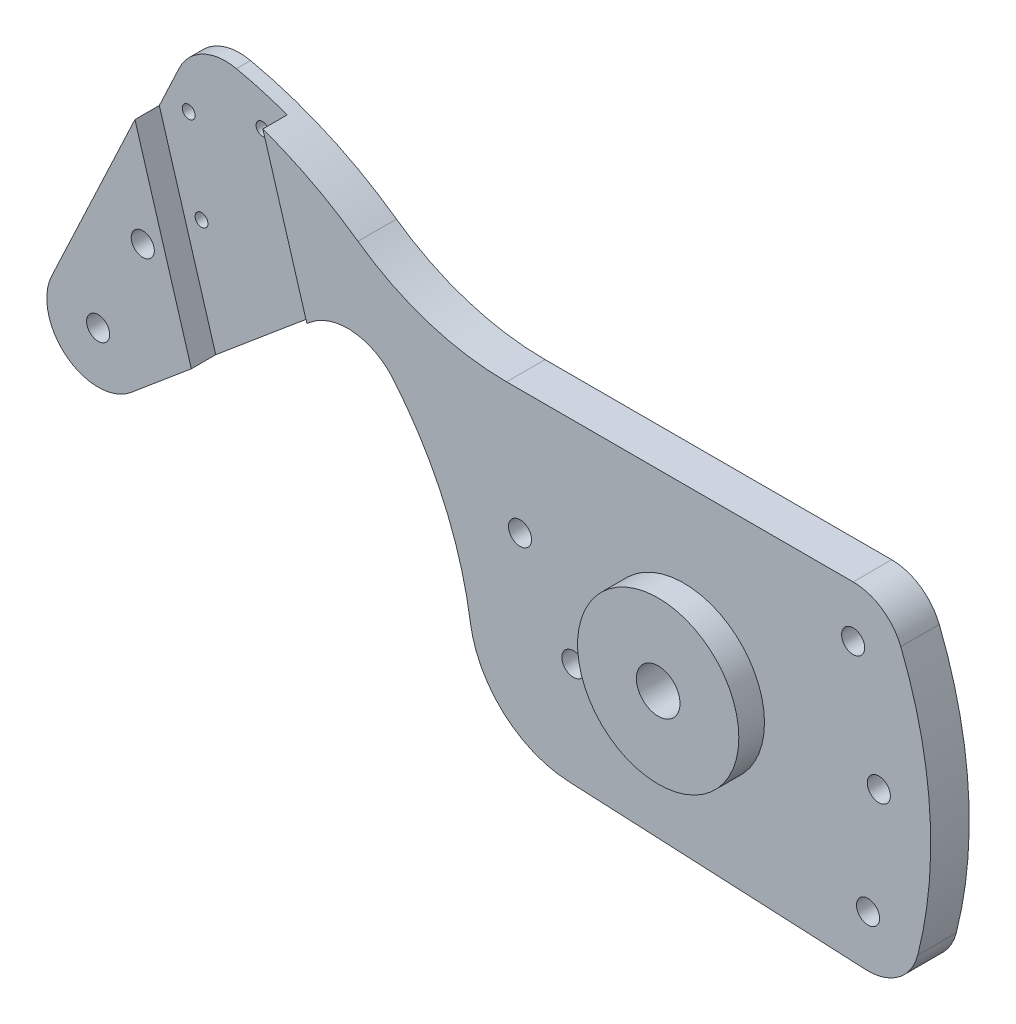
ISO-10303-21;
HEADER;
FILE_DESCRIPTION(('STEP AP214'),'2;1');
FILE_NAME('part.step','',(''),(''),'','','');
FILE_SCHEMA(('AUTOMOTIVE_DESIGN { 1 0 10303 214 1 1 1 1 }'));
ENDSEC;
DATA;
#1=APPLICATION_CONTEXT('core data for automotive mechanical design processes');
#2=APPLICATION_PROTOCOL_DEFINITION('international standard','automotive_design',2000,#1);
#3=PRODUCT_CONTEXT('',#1,'mechanical');
#4=PRODUCT('Part','Part','',(#3));
#5=PRODUCT_RELATED_PRODUCT_CATEGORY('part','',(#4));
#6=PRODUCT_DEFINITION_FORMATION('','',#4);
#7=PRODUCT_DEFINITION_CONTEXT('part definition',#1,'design');
#8=PRODUCT_DEFINITION('design','',#6,#7);
#9=PRODUCT_DEFINITION_SHAPE('','',#8);
#10=(LENGTH_UNIT() NAMED_UNIT(*) SI_UNIT(.MILLI.,.METRE.));
#11=(NAMED_UNIT(*) PLANE_ANGLE_UNIT() SI_UNIT($,.RADIAN.));
#12=(NAMED_UNIT(*) SI_UNIT($,.STERADIAN.) SOLID_ANGLE_UNIT());
#13=UNCERTAINTY_MEASURE_WITH_UNIT(LENGTH_MEASURE(1.E-05),#10,'distance_accuracy_value','');
#14=(GEOMETRIC_REPRESENTATION_CONTEXT(3) GLOBAL_UNCERTAINTY_ASSIGNED_CONTEXT((#13)) GLOBAL_UNIT_ASSIGNED_CONTEXT((#10,
#11,#12)) REPRESENTATION_CONTEXT('',''));
#15=CARTESIAN_POINT('',(0.,0.,0.));
#16=DIRECTION('',(0.,0.,1.));
#17=DIRECTION('',(1.,0.,0.));
#18=AXIS2_PLACEMENT_3D('',#15,#16,#17);
#19=CARTESIAN_POINT('',(-74.1892847970259,-68.5571228840362,-2.));
#20=DIRECTION('',(-0.95769511445002,-0.287784759427187,0.));
#21=DIRECTION('',(0.287784759427187,-0.95769511445002,0.));
#22=AXIS2_PLACEMENT_3D('',#19,#20,#21);
#23=PLANE('',#22);
#24=DIRECTION('',(-0.287784759427187,0.957695114450019,0.));
#25=VECTOR('',#24,1.);
#26=CARTESIAN_POINT('',(-95.9576660688243,3.88407391520334,2.75));
#27=LINE('',#26,#25);
#28=CARTESIAN_POINT('',(-95.9576660688243,3.88407391520334,2.75));
#29=VERTEX_POINT('',#28);
#30=CARTESIAN_POINT('',(-106.945535827358,40.4496974975837,2.75));
#31=VERTEX_POINT('',#30);
#32=EDGE_CURVE('E169',#29,#31,#27,.T.);
#33=ORIENTED_EDGE('',*,*,#32,.F.);
#34=DIRECTION('',(0.,0.,1.));
#35=VECTOR('',#34,1.);
#36=CARTESIAN_POINT('',(-95.9576660688243,3.88407391520334,4.75));
#37=LINE('',#36,#35);
#38=CARTESIAN_POINT('',(-95.9576660688243,3.88407391520334,-2.));
#39=VERTEX_POINT('',#38);
#40=EDGE_CURVE('E180',#39,#29,#37,.T.);
#41=ORIENTED_EDGE('',*,*,#40,.F.);
#42=DIRECTION('',(-0.287784759427187,0.95769511445002,0.));
#43=VECTOR('',#42,1.);
#44=CARTESIAN_POINT('',(-74.1892847970259,-68.5571228840362,-2.));
#45=LINE('',#44,#43);
#46=CARTESIAN_POINT('',(-106.945535827358,40.4496974975837,-2.));
#47=VERTEX_POINT('',#46);
#48=EDGE_CURVE('E11',#39,#47,#45,.T.);
#49=ORIENTED_EDGE('',*,*,#48,.T.);
#50=DIRECTION('',(0.,0.,1.));
#51=VECTOR('',#50,1.);
#52=CARTESIAN_POINT('',(-106.945535827358,40.4496974975837,4.75));
#53=LINE('',#52,#51);
#54=EDGE_CURVE('E183',#47,#31,#53,.T.);
#55=ORIENTED_EDGE('',*,*,#54,.T.);
#56=EDGE_LOOP('',(#33,#41,#49,#55));
#57=FACE_BOUND('',#56,.T.);
#58=ADVANCED_FACE('F40',(#57),#23,.F.);
#59=CARTESIAN_POINT('',(-48.3315167068753,-60.7869343795021,-2.));
#60=DIRECTION('',(0.95769511445002,0.287784759427187,0.));
#61=DIRECTION('',(-0.287784759427187,0.95769511445002,0.));
#62=AXIS2_PLACEMENT_3D('',#59,#60,#61);
#63=PLANE('',#62);
#64=DIRECTION('',(0.287784759427188,-0.95769511445002,0.));
#65=VECTOR('',#64,1.);
#66=CARTESIAN_POINT('',(-82.0220970357489,51.329163249051,2.75));
#67=LINE('',#66,#65);
#68=CARTESIAN_POINT('',(-82.0220970357489,51.329163249051,2.75));
#69=VERTEX_POINT('',#68);
#70=CARTESIAN_POINT('',(-73.4421904308482,22.7768012188099,2.75));
#71=VERTEX_POINT('',#70);
#72=EDGE_CURVE('E429',#69,#71,#67,.T.);
#73=ORIENTED_EDGE('',*,*,#72,.F.);
#74=DIRECTION('',(0.,0.,-1.));
#75=VECTOR('',#74,1.);
#76=CARTESIAN_POINT('',(-82.0220970357489,51.3291632490509,4.75));
#77=LINE('',#76,#75);
#78=CARTESIAN_POINT('',(-82.0220970357489,51.3291632490509,-2.));
#79=VERTEX_POINT('',#78);
#80=EDGE_CURVE('E191',#79,#69,#77,.F.);
#81=ORIENTED_EDGE('',*,*,#80,.F.);
#82=DIRECTION('',(-0.287784759427187,0.95769511445002,0.));
#83=VECTOR('',#82,1.);
#84=CARTESIAN_POINT('',(-48.3315167068753,-60.7869343795021,-2.));
#85=LINE('',#84,#83);
#86=CARTESIAN_POINT('',(-73.4421904308482,22.7768012188099,-2.));
#87=VERTEX_POINT('',#86);
#88=EDGE_CURVE('E50',#87,#79,#85,.T.);
#89=ORIENTED_EDGE('',*,*,#88,.F.);
#90=DIRECTION('',(0.,0.,-1.));
#91=VECTOR('',#90,1.);
#92=CARTESIAN_POINT('',(-73.4421904308482,22.7768012188099,4.75));
#93=LINE('',#92,#91);
#94=EDGE_CURVE('E190',#71,#87,#93,.T.);
#95=ORIENTED_EDGE('',*,*,#94,.F.);
#96=EDGE_LOOP('',(#73,#81,#89,#95));
#97=FACE_BOUND('',#96,.T.);
#98=ADVANCED_FACE('F42',(#97),#63,.F.);
#99=CARTESIAN_POINT('',(-41.5599291638824,49.5291948890183,4.75));
#100=DIRECTION('',(-0.642787609686535,0.766044443118982,0.));
#101=DIRECTION('',(-0.766044443118982,-0.642787609686535,0.));
#102=AXIS2_PLACEMENT_3D('',#99,#100,#101);
#103=PLANE('',#102);
#104=DIRECTION('',(0.766044443118982,0.642787609686534,0.));
#105=VECTOR('',#104,1.);
#106=CARTESIAN_POINT('',(-107.689906175498,-5.96044443118984,2.75));
#107=LINE('',#106,#105);
#108=CARTESIAN_POINT('',(-107.689906175498,-5.96044443118984,2.75));
#109=VERTEX_POINT('',#108);
#110=EDGE_CURVE('E166',#109,#29,#107,.T.);
#111=ORIENTED_EDGE('',*,*,#110,.F.);
#112=DIRECTION('',(0.,0.,-1.));
#113=VECTOR('',#112,1.);
#114=CARTESIAN_POINT('',(-107.689906175498,-5.96044443118984,4.75));
#115=LINE('',#114,#113);
#116=CARTESIAN_POINT('',(-107.689906175498,-5.96044443118984,-4.75));
#117=VERTEX_POINT('',#116);
#118=EDGE_CURVE('E238',#109,#117,#115,.T.);
#119=ORIENTED_EDGE('',*,*,#118,.T.);
#120=DIRECTION('',(0.766044443118982,0.642787609686535,0.));
#121=VECTOR('',#120,1.);
#122=CARTESIAN_POINT('',(-41.5599291638824,49.5291948890183,-4.75));
#123=LINE('',#122,#121);
#124=CARTESIAN_POINT('',(-72.8648183450266,23.2612739230748,-4.75));
#125=VERTEX_POINT('',#124);
#126=EDGE_CURVE('E332',#117,#125,#123,.T.);
#127=ORIENTED_EDGE('',*,*,#126,.T.);
#128=DIRECTION('',(0.,0.,-1.));
#129=VECTOR('',#128,1.);
#130=CARTESIAN_POINT('',(-72.8648183450266,23.2612739230748,4.75));
#131=LINE('',#130,#129);
#132=CARTESIAN_POINT('',(-72.8648183450266,23.2612739230748,2.75));
#133=VERTEX_POINT('',#132);
#134=EDGE_CURVE('E241',#133,#125,#131,.T.);
#135=ORIENTED_EDGE('',*,*,#134,.F.);
#136=DIRECTION('',(0.766044443118984,0.642787609686532,0.));
#137=VECTOR('',#136,1.);
#138=CARTESIAN_POINT('',(-73.4421904308482,22.7768012188099,2.75));
#139=LINE('',#138,#137);
#140=EDGE_CURVE('E426',#71,#133,#139,.T.);
#141=ORIENTED_EDGE('',*,*,#140,.F.);
#142=ORIENTED_EDGE('',*,*,#94,.T.);
#143=DIRECTION('',(0.766044443118982,0.642787609686534,0.));
#144=VECTOR('',#143,1.);
#145=CARTESIAN_POINT('',(-41.5599291638823,49.5291948890183,-2.));
#146=LINE('',#145,#144);
#147=EDGE_CURVE('E188',#39,#87,#146,.T.);
#148=ORIENTED_EDGE('',*,*,#147,.F.);
#149=ORIENTED_EDGE('',*,*,#40,.T.);
#150=EDGE_LOOP('',(#111,#119,#127,#135,#141,#142,#148,#149));
#151=FACE_BOUND('',#150,.T.);
#152=ADVANCED_FACE('F186',(#151),#103,.F.);
#153=CARTESIAN_POINT('',(-34.5381520802066,82.4,4.75));
#154=DIRECTION('',(0.,0.,-1.));
#155=DIRECTION('',(-1.,0.,0.));
#156=AXIS2_PLACEMENT_3D('',#153,#154,#155);
#157=CYLINDRICAL_SURFACE('',#156,50.);
#158=DIRECTION('',(0.,0.,-1.));
#159=VECTOR('',#158,1.);
#160=CARTESIAN_POINT('',(-63.4870210289497,41.6328197370912,4.75));
#161=LINE('',#160,#159);
#162=CARTESIAN_POINT('',(-63.4870210289497,41.6328197370912,2.75));
#163=VERTEX_POINT('',#162);
#164=CARTESIAN_POINT('',(-63.4870210289497,41.6328197370912,-4.75));
#165=VERTEX_POINT('',#164);
#166=EDGE_CURVE('E223',#163,#165,#161,.T.);
#167=ORIENTED_EDGE('',*,*,#166,.F.);
#168=CARTESIAN_POINT('',(-34.5381520802066,82.4,2.75));
#169=DIRECTION('',(0.,0.,-1.));
#170=DIRECTION('',(1.,0.,0.));
#171=AXIS2_PLACEMENT_3D('',#168,#169,#170);
#172=CIRCLE('',#171,50.);
#173=CARTESIAN_POINT('',(-34.5381520802066,32.4,2.75));
#174=VERTEX_POINT('',#173);
#175=EDGE_CURVE('E175',#174,#163,#172,.T.);
#176=ORIENTED_EDGE('',*,*,#175,.F.);
#177=DIRECTION('',(0.,0.,-1.));
#178=VECTOR('',#177,1.);
#179=CARTESIAN_POINT('',(-34.5381520802066,32.4,4.75));
#180=LINE('',#179,#178);
#181=CARTESIAN_POINT('',(-34.5381520802066,32.4,-4.75));
#182=VERTEX_POINT('',#181);
#183=EDGE_CURVE('E265',#174,#182,#180,.T.);
#184=ORIENTED_EDGE('',*,*,#183,.T.);
#185=CARTESIAN_POINT('',(-34.5381520802066,82.4,-4.75));
#186=DIRECTION('',(0.,0.,1.));
#187=DIRECTION('',(1.,0.,0.));
#188=AXIS2_PLACEMENT_3D('',#185,#186,#187);
#189=CIRCLE('',#188,50.);
#190=EDGE_CURVE('E352',#165,#182,#189,.T.);
#191=ORIENTED_EDGE('',*,*,#190,.F.);
#192=EDGE_LOOP('',(#167,#176,#184,#191));
#193=FACE_BOUND('',#192,.T.);
#194=ADVANCED_FACE('F473',(#193),#157,.F.);
#195=CARTESIAN_POINT('',(-108.317782272363,-21.5,4.75));
#196=DIRECTION('',(0.,0.,-1.));
#197=DIRECTION('',(-1.,0.,0.));
#198=AXIS2_PLACEMENT_3D('',#195,#196,#197);
#199=CYLINDRICAL_SURFACE('',#198,77.4309374967139);
#200=CARTESIAN_POINT('',(-108.317782272363,-21.5,2.75));
#201=DIRECTION('',(0.,0.,1.));
#202=DIRECTION('',(1.,0.,0.));
#203=AXIS2_PLACEMENT_3D('',#200,#201,#202);
#204=CIRCLE('',#203,77.430937496714);
#205=EDGE_CURVE('E432',#163,#69,#204,.T.);
#206=ORIENTED_EDGE('',*,*,#205,.F.);
#207=ORIENTED_EDGE('',*,*,#166,.T.);
#208=CARTESIAN_POINT('',(-108.317782272363,-21.5,-4.75));
#209=DIRECTION('',(0.,0.,1.));
#210=DIRECTION('',(1.,0.,0.));
#211=AXIS2_PLACEMENT_3D('',#208,#209,#210);
#212=CIRCLE('',#211,77.4309374967139);
#213=CARTESIAN_POINT('',(-91.9187421242096,54.174444588905,-4.75));
#214=VERTEX_POINT('',#213);
#215=EDGE_CURVE('E348',#165,#214,#212,.T.);
#216=ORIENTED_EDGE('',*,*,#215,.T.);
#217=DIRECTION('',(0.,0.,-1.));
#218=VECTOR('',#217,1.);
#219=CARTESIAN_POINT('',(-91.9187421242096,54.174444588905,4.75));
#220=LINE('',#219,#218);
#221=CARTESIAN_POINT('',(-91.9187421242096,54.174444588905,-2.));
#222=VERTEX_POINT('',#221);
#223=EDGE_CURVE('E229',#222,#214,#220,.T.);
#224=ORIENTED_EDGE('',*,*,#223,.F.);
#225=CARTESIAN_POINT('',(-108.317782272363,-21.5,-2.));
#226=DIRECTION('',(0.,0.,-1.));
#227=DIRECTION('',(-1.,0.,0.));
#228=AXIS2_PLACEMENT_3D('',#225,#226,#227);
#229=CIRCLE('',#228,77.4309374967139);
#230=EDGE_CURVE('E198',#222,#79,#229,.T.);
#231=ORIENTED_EDGE('',*,*,#230,.T.);
#232=ORIENTED_EDGE('',*,*,#80,.T.);
#233=EDGE_LOOP('',(#206,#207,#216,#224,#231,#232));
#234=FACE_BOUND('',#233,.T.);
#235=ADVANCED_FACE('F476',(#234),#199,.T.);
#236=CARTESIAN_POINT('',(-103.154731418742,48.5106034239492,4.75));
#237=DIRECTION('',(-0.904929527308425,0.425561453382882,0.));
#238=DIRECTION('',(-0.425561453382882,-0.904929527308425,0.));
#239=AXIS2_PLACEMENT_3D('',#236,#237,#238);
#240=PLANE('',#239);
#241=DIRECTION('',(0.,0.,-1.));
#242=VECTOR('',#241,1.);
#243=CARTESIAN_POINT('',(-123.167077545448,5.9556145338288,4.75));
#244=LINE('',#243,#242);
#245=CARTESIAN_POINT('',(-123.167077545448,5.9556145338288,2.75));
#246=VERTEX_POINT('',#245);
#247=CARTESIAN_POINT('',(-123.167077545448,5.9556145338288,-4.75));
#248=VERTEX_POINT('',#247);
#249=EDGE_CURVE('E235',#246,#248,#244,.T.);
#250=ORIENTED_EDGE('',*,*,#249,.F.);
#251=DIRECTION('',(-0.425561453382882,-0.904929527308425,0.));
#252=VECTOR('',#251,1.);
#253=CARTESIAN_POINT('',(-106.945535827358,40.4496974975837,2.75));
#254=LINE('',#253,#252);
#255=EDGE_CURVE('E58',#31,#246,#254,.T.);
#256=ORIENTED_EDGE('',*,*,#255,.F.);
#257=ORIENTED_EDGE('',*,*,#54,.F.);
#258=DIRECTION('',(-0.425561453382882,-0.904929527308425,0.));
#259=VECTOR('',#258,1.);
#260=CARTESIAN_POINT('',(-103.154731418742,48.5106034239492,-2.));
#261=LINE('',#260,#259);
#262=CARTESIAN_POINT('',(-103.085929893281,48.6569055183213,-2.));
#263=VERTEX_POINT('',#262);
#264=EDGE_CURVE('E203',#263,#47,#261,.T.);
#265=ORIENTED_EDGE('',*,*,#264,.F.);
#266=DIRECTION('',(0.,0.,-1.));
#267=VECTOR('',#266,1.);
#268=CARTESIAN_POINT('',(-103.085929893281,48.6569055183213,4.75));
#269=LINE('',#268,#267);
#270=CARTESIAN_POINT('',(-103.085929893281,48.6569055183213,-4.75));
#271=VERTEX_POINT('',#270);
#272=EDGE_CURVE('E232',#263,#271,#269,.T.);
#273=ORIENTED_EDGE('',*,*,#272,.T.);
#274=DIRECTION('',(0.425561453382882,0.904929527308425,0.));
#275=VECTOR('',#274,1.);
#276=CARTESIAN_POINT('',(-103.154731418742,48.5106034239492,-4.75));
#277=LINE('',#276,#275);
#278=EDGE_CURVE('E340',#248,#271,#277,.T.);
#279=ORIENTED_EDGE('',*,*,#278,.F.);
#280=EDGE_LOOP('',(#250,#256,#257,#265,#273,#279));
#281=FACE_BOUND('',#280,.T.);
#282=ADVANCED_FACE('F480',(#281),#240,.T.);
#283=CARTESIAN_POINT('',(-114.117782272363,1.69999999999999,4.75));
#284=DIRECTION('',(0.,0.,-1.));
#285=DIRECTION('',(-1.,0.,0.));
#286=AXIS2_PLACEMENT_3D('',#283,#284,#285);
#287=CYLINDRICAL_SURFACE('',#286,9.99999999999999);
#288=CARTESIAN_POINT('',(-114.117782272363,1.69999999999999,2.75));
#289=DIRECTION('',(0.,0.,1.));
#290=DIRECTION('',(1.,0.,0.));
#291=AXIS2_PLACEMENT_3D('',#288,#289,#290);
#292=CIRCLE('',#291,10.);
#293=EDGE_CURVE('E170',#246,#109,#292,.T.);
#294=ORIENTED_EDGE('',*,*,#293,.F.);
#295=ORIENTED_EDGE('',*,*,#249,.T.);
#296=CARTESIAN_POINT('',(-114.117782272363,1.69999999999999,-4.75));
#297=DIRECTION('',(0.,0.,1.));
#298=DIRECTION('',(1.,0.,0.));
#299=AXIS2_PLACEMENT_3D('',#296,#297,#298);
#300=CIRCLE('',#299,9.99999999999999);
#301=EDGE_CURVE('E336',#248,#117,#300,.T.);
#302=ORIENTED_EDGE('',*,*,#301,.T.);
#303=ORIENTED_EDGE('',*,*,#118,.F.);
#304=EDGE_LOOP('',(#294,#295,#302,#303));
#305=FACE_BOUND('',#304,.T.);
#306=ADVANCED_FACE('F489',(#305),#287,.T.);
#307=CARTESIAN_POINT('',(-65.4725042221845,14.4514570095927,4.75));
#308=DIRECTION('',(0.,0.,-1.));
#309=DIRECTION('',(-1.,0.,0.));
#310=AXIS2_PLACEMENT_3D('',#307,#308,#309);
#311=CYLINDRICAL_SURFACE('',#310,11.5003992165423);
#312=DIRECTION('',(0.,0.,-1.));
#313=VECTOR('',#312,1.);
#314=CARTESIAN_POINT('',(-56.6626873087024,21.8437711324349,4.75));
#315=LINE('',#314,#313);
#316=CARTESIAN_POINT('',(-56.6626873087024,21.8437711324349,2.75));
#317=VERTEX_POINT('',#316);
#318=CARTESIAN_POINT('',(-56.6626873087024,21.8437711324349,-4.75));
#319=VERTEX_POINT('',#318);
#320=EDGE_CURVE('E244',#317,#319,#315,.T.);
#321=ORIENTED_EDGE('',*,*,#320,.F.);
#322=CARTESIAN_POINT('',(-65.4725042221845,14.4514570095927,2.75));
#323=DIRECTION('',(0.,0.,-1.));
#324=DIRECTION('',(1.,0.,0.));
#325=AXIS2_PLACEMENT_3D('',#322,#323,#324);
#326=CIRCLE('',#325,11.5003992165423);
#327=EDGE_CURVE('E423',#133,#317,#326,.T.);
#328=ORIENTED_EDGE('',*,*,#327,.F.);
#329=ORIENTED_EDGE('',*,*,#134,.T.);
#330=CARTESIAN_POINT('',(-65.4725042221845,14.4514570095927,-4.75));
#331=DIRECTION('',(0.,0.,1.));
#332=DIRECTION('',(1.,0.,0.));
#333=AXIS2_PLACEMENT_3D('',#330,#331,#332);
#334=CIRCLE('',#333,11.5003992165423);
#335=EDGE_CURVE('E328',#319,#125,#334,.T.);
#336=ORIENTED_EDGE('',*,*,#335,.F.);
#337=EDGE_LOOP('',(#321,#328,#329,#336));
#338=FACE_BOUND('',#337,.T.);
#339=ADVANCED_FACE('F493',(#338),#311,.F.);
#340=CARTESIAN_POINT('',(-108.317782272363,-21.5,4.75));
#341=DIRECTION('',(0.,0.,-1.));
#342=DIRECTION('',(-1.,0.,0.));
#343=AXIS2_PLACEMENT_3D('',#340,#341,#342);
#344=CYLINDRICAL_SURFACE('',#343,67.4309374967139);
#345=DIRECTION('',(0.,0.,-1.));
#346=VECTOR('',#345,1.);
#347=CARTESIAN_POINT('',(-41.6082780723541,-11.662653758524,4.75));
#348=LINE('',#347,#346);
#349=CARTESIAN_POINT('',(-41.6082780723541,-11.662653758524,2.75));
#350=VERTEX_POINT('',#349);
#351=CARTESIAN_POINT('',(-41.6082780723541,-11.662653758524,-4.75));
#352=VERTEX_POINT('',#351);
#353=EDGE_CURVE('E247',#350,#352,#348,.T.);
#354=ORIENTED_EDGE('',*,*,#353,.F.);
#355=CARTESIAN_POINT('',(-108.317782272363,-21.5,2.75));
#356=DIRECTION('',(0.,0.,-1.));
#357=DIRECTION('',(1.,0.,0.));
#358=AXIS2_PLACEMENT_3D('',#355,#356,#357);
#359=CIRCLE('',#358,67.4309374967139);
#360=EDGE_CURVE('E420',#317,#350,#359,.T.);
#361=ORIENTED_EDGE('',*,*,#360,.F.);
#362=ORIENTED_EDGE('',*,*,#320,.T.);
#363=CARTESIAN_POINT('',(-108.317782272363,-21.5,-4.75));
#364=DIRECTION('',(0.,0.,1.));
#365=DIRECTION('',(1.,0.,0.));
#366=AXIS2_PLACEMENT_3D('',#363,#364,#365);
#367=CIRCLE('',#366,67.4309374967139);
#368=EDGE_CURVE('E324',#352,#319,#367,.T.);
#369=ORIENTED_EDGE('',*,*,#368,.F.);
#370=EDGE_LOOP('',(#354,#361,#362,#369));
#371=FACE_BOUND('',#370,.T.);
#372=ADVANCED_FACE('F499',(#371),#344,.F.);
#373=CARTESIAN_POINT('',(-21.5177822723635,-8.70000000000001,4.75));
#374=DIRECTION('',(0.,0.,-1.));
#375=DIRECTION('',(-1.,0.,0.));
#376=AXIS2_PLACEMENT_3D('',#373,#374,#375);
#377=CYLINDRICAL_SURFACE('',#376,20.3077654797946);
#378=CARTESIAN_POINT('',(-21.5177822723635,-8.70000000000001,2.75));
#379=DIRECTION('',(0.,0.,1.));
#380=DIRECTION('',(1.,0.,0.));
#381=AXIS2_PLACEMENT_3D('',#378,#379,#380);
#382=CIRCLE('',#381,20.3077654797946);
#383=CARTESIAN_POINT('',(-22.5002308320871,-28.9839871230938,2.75));
#384=VERTEX_POINT('',#383);
#385=EDGE_CURVE('E417',#350,#384,#382,.T.);
#386=ORIENTED_EDGE('',*,*,#385,.F.);
#387=ORIENTED_EDGE('',*,*,#353,.T.);
#388=CARTESIAN_POINT('',(-21.5177822723635,-8.70000000000001,-4.75));
#389=DIRECTION('',(0.,0.,1.));
#390=DIRECTION('',(1.,0.,0.));
#391=AXIS2_PLACEMENT_3D('',#388,#389,#390);
#392=CIRCLE('',#391,20.3077654797946);
#393=CARTESIAN_POINT('',(-22.5002308320871,-28.9839871230938,-4.75));
#394=VERTEX_POINT('',#393);
#395=EDGE_CURVE('E320',#352,#394,#392,.T.);
#396=ORIENTED_EDGE('',*,*,#395,.T.);
#397=DIRECTION('',(0.,0.,-1.));
#398=VECTOR('',#397,1.);
#399=CARTESIAN_POINT('',(-22.5002308320871,-28.9839871230938,4.75));
#400=LINE('',#399,#398);
#401=EDGE_CURVE('E250',#384,#394,#400,.T.);
#402=ORIENTED_EDGE('',*,*,#401,.F.);
#403=EDGE_LOOP('',(#386,#387,#396,#402));
#404=FACE_BOUND('',#403,.T.);
#405=ADVANCED_FACE('F503',(#404),#377,.T.);
#406=CARTESIAN_POINT('',(-1.45320494845944,-30.0033932260633,4.75));
#407=DIRECTION('',(-0.0483779744601208,-0.998829100290503,0.));
#408=DIRECTION('',(0.998829100290503,-0.0483779744601208,0.));
#409=AXIS2_PLACEMENT_3D('',#406,#407,#408);
#410=PLANE('',#409);
#411=DIRECTION('',(0.,0.,-1.));
#412=VECTOR('',#411,1.);
#413=CARTESIAN_POINT('',(35.3984379830354,-31.788291002905,4.75));
#414=LINE('',#413,#412);
#415=CARTESIAN_POINT('',(35.3984379830354,-31.788291002905,2.75));
#416=VERTEX_POINT('',#415);
#417=CARTESIAN_POINT('',(35.3984379830354,-31.788291002905,-4.75));
#418=VERTEX_POINT('',#417);
#419=EDGE_CURVE('E253',#416,#418,#414,.T.);
#420=ORIENTED_EDGE('',*,*,#419,.F.);
#421=DIRECTION('',(0.998829100290503,-0.0483779744601209,0.));
#422=VECTOR('',#421,1.);
#423=CARTESIAN_POINT('',(-22.5002308320871,-28.9839871230938,2.75));
#424=LINE('',#423,#422);
#425=EDGE_CURVE('E414',#384,#416,#424,.T.);
#426=ORIENTED_EDGE('',*,*,#425,.F.);
#427=ORIENTED_EDGE('',*,*,#401,.T.);
#428=DIRECTION('',(-0.998829100290503,0.0483779744601208,0.));
#429=VECTOR('',#428,1.);
#430=CARTESIAN_POINT('',(-1.45320494845944,-30.0033932260633,-4.75));
#431=LINE('',#430,#429);
#432=EDGE_CURVE('E316',#418,#394,#431,.T.);
#433=ORIENTED_EDGE('',*,*,#432,.F.);
#434=EDGE_LOOP('',(#420,#426,#427,#433));
#435=FACE_BOUND('',#434,.T.);
#436=ADVANCED_FACE('F507',(#435),#410,.T.);
#437=CARTESIAN_POINT('',(35.8822177276366,-21.8,4.75));
#438=DIRECTION('',(0.,0.,-1.));
#439=DIRECTION('',(-1.,0.,0.));
#440=AXIS2_PLACEMENT_3D('',#437,#438,#439);
#441=CYLINDRICAL_SURFACE('',#440,9.99999999999999);
#442=CARTESIAN_POINT('',(35.8822177276366,-21.8,2.75));
#443=DIRECTION('',(0.,0.,1.));
#444=DIRECTION('',(1.,0.,0.));
#445=AXIS2_PLACEMENT_3D('',#442,#443,#444);
#446=CIRCLE('',#445,9.99999999999999);
#447=CARTESIAN_POINT('',(45.5722671365024,-24.2704134175759,2.75));
#448=VERTEX_POINT('',#447);
#449=EDGE_CURVE('E411',#416,#448,#446,.T.);
#450=ORIENTED_EDGE('',*,*,#449,.F.);
#451=ORIENTED_EDGE('',*,*,#419,.T.);
#452=CARTESIAN_POINT('',(35.8822177276366,-21.8,-4.75));
#453=DIRECTION('',(0.,0.,1.));
#454=DIRECTION('',(1.,0.,0.));
#455=AXIS2_PLACEMENT_3D('',#452,#453,#454);
#456=CIRCLE('',#455,9.99999999999999);
#457=CARTESIAN_POINT('',(45.5722671365024,-24.2704134175759,-4.75));
#458=VERTEX_POINT('',#457);
#459=EDGE_CURVE('E312',#418,#458,#456,.T.);
#460=ORIENTED_EDGE('',*,*,#459,.T.);
#461=DIRECTION('',(0.,0.,-1.));
#462=VECTOR('',#461,1.);
#463=CARTESIAN_POINT('',(45.5722671365024,-24.2704134175759,4.75));
#464=LINE('',#463,#462);
#465=EDGE_CURVE('E256',#448,#458,#464,.T.);
#466=ORIENTED_EDGE('',*,*,#465,.F.);
#467=EDGE_LOOP('',(#450,#451,#460,#466));
#468=FACE_BOUND('',#467,.T.);
#469=ADVANCED_FACE('F511',(#468),#441,.T.);
#470=CARTESIAN_POINT('',(-33.3576699128129,-4.14775280898879,4.75));
#471=DIRECTION('',(0.,0.,-1.));
#472=DIRECTION('',(-1.,0.,0.));
#473=AXIS2_PLACEMENT_3D('',#470,#471,#472);
#474=CYLINDRICAL_SURFACE('',#473,81.4546280611314);
#475=CARTESIAN_POINT('',(-33.3576699128129,-4.14775280898879,2.75));
#476=DIRECTION('',(0.,0.,1.));
#477=DIRECTION('',(1.,0.,0.));
#478=AXIS2_PLACEMENT_3D('',#475,#476,#477);
#479=CIRCLE('',#478,81.4546280611314);
#480=CARTESIAN_POINT('',(42.2664151883936,26.1153300673927,2.75));
#481=VERTEX_POINT('',#480);
#482=EDGE_CURVE('E408',#448,#481,#479,.T.);
#483=ORIENTED_EDGE('',*,*,#482,.F.);
#484=ORIENTED_EDGE('',*,*,#465,.T.);
#485=CARTESIAN_POINT('',(-33.3576699128129,-4.14775280898879,-4.75));
#486=DIRECTION('',(0.,0.,1.));
#487=DIRECTION('',(1.,0.,0.));
#488=AXIS2_PLACEMENT_3D('',#485,#486,#487);
#489=CIRCLE('',#488,81.4546280611314);
#490=CARTESIAN_POINT('',(42.2664151883936,26.1153300673927,-4.75));
#491=VERTEX_POINT('',#490);
#492=EDGE_CURVE('E308',#458,#491,#489,.T.);
#493=ORIENTED_EDGE('',*,*,#492,.T.);
#494=DIRECTION('',(0.,0.,-1.));
#495=VECTOR('',#494,1.);
#496=CARTESIAN_POINT('',(42.2664151883936,26.1153300673927,4.75));
#497=LINE('',#496,#495);
#498=EDGE_CURVE('E259',#481,#491,#497,.T.);
#499=ORIENTED_EDGE('',*,*,#498,.F.);
#500=EDGE_LOOP('',(#483,#484,#493,#499));
#501=FACE_BOUND('',#500,.T.);
#502=ADVANCED_FACE('F515',(#501),#474,.T.);
#503=CARTESIAN_POINT('',(32.9822177276365,22.4,4.75));
#504=DIRECTION('',(0.,0.,-1.));
#505=DIRECTION('',(-1.,0.,0.));
#506=AXIS2_PLACEMENT_3D('',#503,#504,#505);
#507=CYLINDRICAL_SURFACE('',#506,9.99999999999999);
#508=CARTESIAN_POINT('',(32.9822177276365,22.4,2.75));
#509=DIRECTION('',(0.,0.,1.));
#510=DIRECTION('',(1.,0.,0.));
#511=AXIS2_PLACEMENT_3D('',#508,#509,#510);
#512=CIRCLE('',#511,9.99999999999999);
#513=CARTESIAN_POINT('',(32.9822177276365,32.4,2.75));
#514=VERTEX_POINT('',#513);
#515=EDGE_CURVE('E66',#481,#514,#512,.T.);
#516=ORIENTED_EDGE('',*,*,#515,.F.);
#517=ORIENTED_EDGE('',*,*,#498,.T.);
#518=CARTESIAN_POINT('',(32.9822177276365,22.4,-4.75));
#519=DIRECTION('',(0.,0.,1.));
#520=DIRECTION('',(1.,0.,0.));
#521=AXIS2_PLACEMENT_3D('',#518,#519,#520);
#522=CIRCLE('',#521,9.99999999999999);
#523=CARTESIAN_POINT('',(32.9822177276365,32.4,-4.75));
#524=VERTEX_POINT('',#523);
#525=EDGE_CURVE('E304',#491,#524,#522,.T.);
#526=ORIENTED_EDGE('',*,*,#525,.T.);
#527=DIRECTION('',(0.,0.,-1.));
#528=VECTOR('',#527,1.);
#529=CARTESIAN_POINT('',(32.9822177276365,32.4,4.75));
#530=LINE('',#529,#528);
#531=EDGE_CURVE('E262',#514,#524,#530,.T.);
#532=ORIENTED_EDGE('',*,*,#531,.F.);
#533=EDGE_LOOP('',(#516,#517,#526,#532));
#534=FACE_BOUND('',#533,.T.);
#535=ADVANCED_FACE('F519',(#534),#507,.T.);
#536=CARTESIAN_POINT('',(-105.417782272363,20.2,4.75));
#537=DIRECTION('',(0.,0.,-1.));
#538=DIRECTION('',(-1.,0.,0.));
#539=AXIS2_PLACEMENT_3D('',#536,#537,#538);
#540=CYLINDRICAL_SURFACE('',#539,2.25);
#541=CARTESIAN_POINT('',(-105.417782272363,20.2,-4.75));
#542=DIRECTION('',(0.,0.,1.));
#543=DIRECTION('',(1.,0.,0.));
#544=AXIS2_PLACEMENT_3D('',#541,#542,#543);
#545=CIRCLE('',#544,2.25);
#546=CARTESIAN_POINT('',(-103.167782272363,20.2,-4.75));
#547=VERTEX_POINT('',#546);
#548=EDGE_CURVE('E272',#547,#547,#545,.T.);
#549=ORIENTED_EDGE('',*,*,#548,.F.);
#550=EDGE_LOOP('',(#549));
#551=FACE_BOUND('',#550,.T.);
#552=CARTESIAN_POINT('',(-105.417782272363,20.2,2.75));
#553=DIRECTION('',(0.,0.,1.));
#554=DIRECTION('',(1.,0.,0.));
#555=AXIS2_PLACEMENT_3D('',#552,#553,#554);
#556=CIRCLE('',#555,2.25);
#557=CARTESIAN_POINT('',(-103.167782272363,20.2,2.75));
#558=VERTEX_POINT('',#557);
#559=EDGE_CURVE('E397',#558,#558,#556,.T.);
#560=ORIENTED_EDGE('',*,*,#559,.T.);
#561=EDGE_LOOP('',(#560));
#562=FACE_BOUND('',#561,.T.);
#563=ADVANCED_FACE('F523',(#551,#562),#540,.F.);
#564=CARTESIAN_POINT('',(-31.9177822723635,8.19999999999999,4.75));
#565=DIRECTION('',(0.,0.,-1.));
#566=DIRECTION('',(-1.,0.,0.));
#567=AXIS2_PLACEMENT_3D('',#564,#565,#566);
#568=CYLINDRICAL_SURFACE('',#567,2.25);
#569=CARTESIAN_POINT('',(-31.9177822723635,8.19999999999999,-4.75));
#570=DIRECTION('',(0.,0.,1.));
#571=DIRECTION('',(1.,0.,0.));
#572=AXIS2_PLACEMENT_3D('',#569,#570,#571);
#573=CIRCLE('',#572,2.25);
#574=CARTESIAN_POINT('',(-29.6677822723635,8.19999999999999,-4.75));
#575=VERTEX_POINT('',#574);
#576=EDGE_CURVE('E280',#575,#575,#573,.T.);
#577=ORIENTED_EDGE('',*,*,#576,.F.);
#578=EDGE_LOOP('',(#577));
#579=FACE_BOUND('',#578,.T.);
#580=CARTESIAN_POINT('',(-31.9177822723635,8.19999999999999,2.75));
#581=DIRECTION('',(0.,0.,1.));
#582=DIRECTION('',(1.,0.,0.));
#583=AXIS2_PLACEMENT_3D('',#580,#581,#582);
#584=CIRCLE('',#583,2.25);
#585=CARTESIAN_POINT('',(-29.6677822723635,8.19999999999999,2.75));
#586=VERTEX_POINT('',#585);
#587=EDGE_CURVE('E367',#586,#586,#584,.T.);
#588=ORIENTED_EDGE('',*,*,#587,.T.);
#589=EDGE_LOOP('',(#588));
#590=FACE_BOUND('',#589,.T.);
#591=ADVANCED_FACE('F545',(#579,#590),#568,.F.);
#592=CARTESIAN_POINT('',(-21.5177822723635,-8.70000000000001,4.75));
#593=DIRECTION('',(0.,0.,-1.));
#594=DIRECTION('',(-1.,0.,0.));
#595=AXIS2_PLACEMENT_3D('',#592,#593,#594);
#596=CYLINDRICAL_SURFACE('',#595,2.25);
#597=CARTESIAN_POINT('',(-21.5177822723635,-8.70000000000001,-4.75));
#598=DIRECTION('',(0.,0.,1.));
#599=DIRECTION('',(1.,0.,0.));
#600=AXIS2_PLACEMENT_3D('',#597,#598,#599);
#601=CIRCLE('',#600,2.25);
#602=CARTESIAN_POINT('',(-19.2677822723635,-8.70000000000001,-4.75));
#603=VERTEX_POINT('',#602);
#604=EDGE_CURVE('E284',#603,#603,#601,.T.);
#605=ORIENTED_EDGE('',*,*,#604,.F.);
#606=EDGE_LOOP('',(#605));
#607=FACE_BOUND('',#606,.T.);
#608=CARTESIAN_POINT('',(-21.5177822723635,-8.70000000000001,2.75));
#609=DIRECTION('',(0.,0.,1.));
#610=DIRECTION('',(1.,0.,0.));
#611=AXIS2_PLACEMENT_3D('',#608,#609,#610);
#612=CIRCLE('',#611,2.25);
#613=CARTESIAN_POINT('',(-19.2677822723635,-8.70000000000001,2.75));
#614=VERTEX_POINT('',#613);
#615=EDGE_CURVE('E381',#614,#614,#612,.T.);
#616=ORIENTED_EDGE('',*,*,#615,.T.);
#617=EDGE_LOOP('',(#616));
#618=FACE_BOUND('',#617,.T.);
#619=ADVANCED_FACE('F541',(#607,#618),#596,.F.);
#620=CARTESIAN_POINT('',(32.9822177276365,22.4,4.75));
#621=DIRECTION('',(0.,0.,-1.));
#622=DIRECTION('',(-1.,0.,0.));
#623=AXIS2_PLACEMENT_3D('',#620,#621,#622);
#624=CYLINDRICAL_SURFACE('',#623,2.25);
#625=CARTESIAN_POINT('',(32.9822177276365,22.4,-4.75));
#626=DIRECTION('',(0.,0.,1.));
#627=DIRECTION('',(1.,0.,0.));
#628=AXIS2_PLACEMENT_3D('',#625,#626,#627);
#629=CIRCLE('',#628,2.25);
#630=CARTESIAN_POINT('',(35.2322177276365,22.4,-4.75));
#631=VERTEX_POINT('',#630);
#632=EDGE_CURVE('E288',#631,#631,#629,.T.);
#633=ORIENTED_EDGE('',*,*,#632,.F.);
#634=EDGE_LOOP('',(#633));
#635=FACE_BOUND('',#634,.T.);
#636=CARTESIAN_POINT('',(32.9822177276365,22.4,2.75));
#637=DIRECTION('',(0.,0.,1.));
#638=DIRECTION('',(1.,0.,0.));
#639=AXIS2_PLACEMENT_3D('',#636,#637,#638);
#640=CIRCLE('',#639,2.25);
#641=CARTESIAN_POINT('',(35.2322177276365,22.4,2.75));
#642=VERTEX_POINT('',#641);
#643=EDGE_CURVE('E385',#642,#642,#640,.T.);
#644=ORIENTED_EDGE('',*,*,#643,.T.);
#645=EDGE_LOOP('',(#644));
#646=FACE_BOUND('',#645,.T.);
#647=ADVANCED_FACE('F537',(#635,#646),#624,.F.);
#648=CARTESIAN_POINT('',(37.9822177276365,-0.100000000000011,4.75));
#649=DIRECTION('',(0.,0.,-1.));
#650=DIRECTION('',(-1.,0.,0.));
#651=AXIS2_PLACEMENT_3D('',#648,#649,#650);
#652=CYLINDRICAL_SURFACE('',#651,2.25);
#653=CARTESIAN_POINT('',(37.9822177276365,-0.100000000000011,-4.75));
#654=DIRECTION('',(0.,0.,1.));
#655=DIRECTION('',(1.,0.,0.));
#656=AXIS2_PLACEMENT_3D('',#653,#654,#655);
#657=CIRCLE('',#656,2.25);
#658=CARTESIAN_POINT('',(40.2322177276366,-0.100000000000011,-4.75));
#659=VERTEX_POINT('',#658);
#660=EDGE_CURVE('E292',#659,#659,#657,.T.);
#661=ORIENTED_EDGE('',*,*,#660,.F.);
#662=EDGE_LOOP('',(#661));
#663=FACE_BOUND('',#662,.T.);
#664=CARTESIAN_POINT('',(37.9822177276365,-0.100000000000011,2.75));
#665=DIRECTION('',(0.,0.,1.));
#666=DIRECTION('',(1.,0.,0.));
#667=AXIS2_PLACEMENT_3D('',#664,#665,#666);
#668=CIRCLE('',#667,2.25);
#669=CARTESIAN_POINT('',(40.2322177276366,-0.100000000000011,2.75));
#670=VERTEX_POINT('',#669);
#671=EDGE_CURVE('E389',#670,#670,#668,.T.);
#672=ORIENTED_EDGE('',*,*,#671,.T.);
#673=EDGE_LOOP('',(#672));
#674=FACE_BOUND('',#673,.T.);
#675=ADVANCED_FACE('F533',(#663,#674),#652,.F.);
#676=CARTESIAN_POINT('',(35.8822177276366,-21.8,4.75));
#677=DIRECTION('',(0.,0.,-1.));
#678=DIRECTION('',(-1.,0.,0.));
#679=AXIS2_PLACEMENT_3D('',#676,#677,#678);
#680=CYLINDRICAL_SURFACE('',#679,2.25);
#681=CARTESIAN_POINT('',(35.8822177276366,-21.8,-4.75));
#682=DIRECTION('',(0.,0.,1.));
#683=DIRECTION('',(1.,0.,0.));
#684=AXIS2_PLACEMENT_3D('',#681,#682,#683);
#685=CIRCLE('',#684,2.25);
#686=CARTESIAN_POINT('',(38.1322177276366,-21.8,-4.75));
#687=VERTEX_POINT('',#686);
#688=EDGE_CURVE('E296',#687,#687,#685,.T.);
#689=ORIENTED_EDGE('',*,*,#688,.F.);
#690=EDGE_LOOP('',(#689));
#691=FACE_BOUND('',#690,.T.);
#692=CARTESIAN_POINT('',(35.8822177276366,-21.8,2.75));
#693=DIRECTION('',(0.,0.,1.));
#694=DIRECTION('',(1.,0.,0.));
#695=AXIS2_PLACEMENT_3D('',#692,#693,#694);
#696=CIRCLE('',#695,2.25);
#697=CARTESIAN_POINT('',(38.1322177276366,-21.8,2.75));
#698=VERTEX_POINT('',#697);
#699=EDGE_CURVE('E393',#698,#698,#696,.T.);
#700=ORIENTED_EDGE('',*,*,#699,.T.);
#701=EDGE_LOOP('',(#700));
#702=FACE_BOUND('',#701,.T.);
#703=ADVANCED_FACE('F529',(#691,#702),#680,.F.);
#704=CARTESIAN_POINT('',(0.,32.4,4.75));
#705=DIRECTION('',(0.,1.,0.));
#706=DIRECTION('',(0.,0.,1.));
#707=AXIS2_PLACEMENT_3D('',#704,#705,#706);
#708=PLANE('',#707);
#709=ORIENTED_EDGE('',*,*,#183,.F.);
#710=DIRECTION('',(-1.,0.,0.));
#711=VECTOR('',#710,1.);
#712=CARTESIAN_POINT('',(32.9822177276365,32.4,2.75));
#713=LINE('',#712,#711);
#714=EDGE_CURVE('E403',#514,#174,#713,.T.);
#715=ORIENTED_EDGE('',*,*,#714,.F.);
#716=ORIENTED_EDGE('',*,*,#531,.T.);
#717=DIRECTION('',(1.,0.,0.));
#718=VECTOR('',#717,1.);
#719=CARTESIAN_POINT('',(0.,32.4,-4.75));
#720=LINE('',#719,#718);
#721=EDGE_CURVE('E300',#182,#524,#720,.T.);
#722=ORIENTED_EDGE('',*,*,#721,.F.);
#723=EDGE_LOOP('',(#709,#715,#716,#722));
#724=FACE_BOUND('',#723,.T.);
#725=ADVANCED_FACE('F525',(#724),#708,.T.);
#726=CARTESIAN_POINT('',(-114.117782272363,1.69999999999999,4.75));
#727=DIRECTION('',(0.,0.,-1.));
#728=DIRECTION('',(-1.,0.,0.));
#729=AXIS2_PLACEMENT_3D('',#726,#727,#728);
#730=CYLINDRICAL_SURFACE('',#729,2.25);
#731=CARTESIAN_POINT('',(-114.117782272363,1.69999999999999,-4.75));
#732=DIRECTION('',(0.,0.,1.));
#733=DIRECTION('',(1.,0.,0.));
#734=AXIS2_PLACEMENT_3D('',#731,#732,#733);
#735=CIRCLE('',#734,2.25);
#736=CARTESIAN_POINT('',(-111.867782272363,1.69999999999999,-4.75));
#737=VERTEX_POINT('',#736);
#738=EDGE_CURVE('E268',#737,#737,#735,.T.);
#739=ORIENTED_EDGE('',*,*,#738,.F.);
#740=EDGE_LOOP('',(#739));
#741=FACE_BOUND('',#740,.T.);
#742=CARTESIAN_POINT('',(-114.117782272363,1.69999999999999,2.75));
#743=DIRECTION('',(0.,0.,1.));
#744=DIRECTION('',(1.,0.,0.));
#745=AXIS2_PLACEMENT_3D('',#742,#743,#744);
#746=CIRCLE('',#745,2.25);
#747=CARTESIAN_POINT('',(-111.867782272363,1.69999999999999,2.75));
#748=VERTEX_POINT('',#747);
#749=EDGE_CURVE('E44',#748,#748,#746,.T.);
#750=ORIENTED_EDGE('',*,*,#749,.T.);
#751=EDGE_LOOP('',(#750));
#752=FACE_BOUND('',#751,.T.);
#753=ADVANCED_FACE('F528',(#741,#752),#730,.F.);
#754=CARTESIAN_POINT('',(0.,0.,-2.));
#755=DIRECTION('',(0.,0.,1.));
#756=DIRECTION('',(1.,0.,0.));
#757=AXIS2_PLACEMENT_3D('',#754,#755,#756);
#758=PLANE('',#757);
#759=ORIENTED_EDGE('',*,*,#147,.T.);
#760=ORIENTED_EDGE('',*,*,#88,.T.);
#761=ORIENTED_EDGE('',*,*,#230,.F.);
#762=CARTESIAN_POINT('',(-94.0366346201967,44.4012909844925,-2.));
#763=DIRECTION('',(0.,0.,1.));
#764=DIRECTION('',(1.,0.,0.));
#765=AXIS2_PLACEMENT_3D('',#762,#763,#764);
#766=CIRCLE('',#765,9.99999999999998);
#767=EDGE_CURVE('E358',#222,#263,#766,.T.);
#768=ORIENTED_EDGE('',*,*,#767,.T.);
#769=ORIENTED_EDGE('',*,*,#264,.T.);
#770=ORIENTED_EDGE('',*,*,#48,.F.);
#771=EDGE_LOOP('',(#759,#760,#761,#768,#769,#770));
#772=FACE_BOUND('',#771,.T.);
#773=CARTESIAN_POINT('',(-98.7212448544347,25.2426264445703,-2.));
#774=DIRECTION('',(0.,0.,-1.));
#775=DIRECTION('',(-1.,0.,0.));
#776=AXIS2_PLACEMENT_3D('',#773,#774,#775);
#777=CIRCLE('',#776,1.25);
#778=CARTESIAN_POINT('',(-99.9712448544347,25.2426264445703,-2.));
#779=VERTEX_POINT('',#778);
#780=EDGE_CURVE('E195',#779,#779,#777,.F.);
#781=ORIENTED_EDGE('',*,*,#780,.F.);
#782=EDGE_LOOP('',(#781));
#783=FACE_BOUND('',#782,.T.);
#784=CARTESIAN_POINT('',(-101.219347978572,42.2429052887889,-2.));
#785=DIRECTION('',(0.,0.,-1.));
#786=DIRECTION('',(-1.,0.,0.));
#787=AXIS2_PLACEMENT_3D('',#784,#785,#786);
#788=CIRCLE('',#787,1.25);
#789=CARTESIAN_POINT('',(-102.469347978572,42.2429052887889,-2.));
#790=VERTEX_POINT('',#789);
#791=EDGE_CURVE('E212',#790,#790,#788,.F.);
#792=ORIENTED_EDGE('',*,*,#791,.F.);
#793=EDGE_LOOP('',(#792));
#794=FACE_BOUND('',#793,.T.);
#795=CARTESIAN_POINT('',(-86.8539212618216,46.5596766801966,-2.));
#796=DIRECTION('',(0.,0.,-1.));
#797=DIRECTION('',(-1.,0.,0.));
#798=AXIS2_PLACEMENT_3D('',#795,#796,#797);
#799=CIRCLE('',#798,1.25);
#800=CARTESIAN_POINT('',(-88.1039212618216,46.5596766801966,-2.));
#801=VERTEX_POINT('',#800);
#802=EDGE_CURVE('E208',#801,#801,#799,.F.);
#803=ORIENTED_EDGE('',*,*,#802,.F.);
#804=EDGE_LOOP('',(#803));
#805=FACE_BOUND('',#804,.T.);
#806=CARTESIAN_POINT('',(-79.5673425654343,30.998321633114,-2.));
#807=DIRECTION('',(0.,0.,-1.));
#808=DIRECTION('',(-1.,0.,0.));
#809=AXIS2_PLACEMENT_3D('',#806,#807,#808);
#810=CIRCLE('',#809,1.25);
#811=CARTESIAN_POINT('',(-80.8173425654343,30.998321633114,-2.));
#812=VERTEX_POINT('',#811);
#813=EDGE_CURVE('E204',#812,#812,#810,.F.);
#814=ORIENTED_EDGE('',*,*,#813,.F.);
#815=EDGE_LOOP('',(#814));
#816=FACE_BOUND('',#815,.T.);
#817=ADVANCED_FACE('F559',(#772,#783,#794,#805,#816),#758,.T.);
#818=CARTESIAN_POINT('',(-79.5673425654343,30.998321633114,-4.75));
#819=DIRECTION('',(0.,0.,1.));
#820=DIRECTION('',(1.,0.,0.));
#821=AXIS2_PLACEMENT_3D('',#818,#819,#820);
#822=CYLINDRICAL_SURFACE('',#821,1.25);
#823=ORIENTED_EDGE('',*,*,#813,.T.);
#824=EDGE_LOOP('',(#823));
#825=FACE_BOUND('',#824,.T.);
#826=CARTESIAN_POINT('',(-79.5673425654343,30.998321633114,-4.75));
#827=DIRECTION('',(0.,0.,1.));
#828=DIRECTION('',(1.,0.,0.));
#829=AXIS2_PLACEMENT_3D('',#826,#827,#828);
#830=CIRCLE('',#829,1.25);
#831=CARTESIAN_POINT('',(-78.3173425654343,30.998321633114,-4.75));
#832=VERTEX_POINT('',#831);
#833=EDGE_CURVE('E362',#832,#832,#830,.T.);
#834=ORIENTED_EDGE('',*,*,#833,.F.);
#835=EDGE_LOOP('',(#834));
#836=FACE_BOUND('',#835,.T.);
#837=ADVANCED_FACE('F566',(#825,#836),#822,.F.);
#838=CARTESIAN_POINT('',(-86.8539212618216,46.5596766801966,-4.75));
#839=DIRECTION('',(0.,0.,1.));
#840=DIRECTION('',(1.,0.,0.));
#841=AXIS2_PLACEMENT_3D('',#838,#839,#840);
#842=CYLINDRICAL_SURFACE('',#841,1.25);
#843=ORIENTED_EDGE('',*,*,#802,.T.);
#844=EDGE_LOOP('',(#843));
#845=FACE_BOUND('',#844,.T.);
#846=CARTESIAN_POINT('',(-86.8539212618216,46.5596766801966,-4.75));
#847=DIRECTION('',(0.,0.,1.));
#848=DIRECTION('',(1.,0.,0.));
#849=AXIS2_PLACEMENT_3D('',#846,#847,#848);
#850=CIRCLE('',#849,1.25);
#851=CARTESIAN_POINT('',(-85.6039212618216,46.5596766801966,-4.75));
#852=VERTEX_POINT('',#851);
#853=EDGE_CURVE('E366',#852,#852,#850,.T.);
#854=ORIENTED_EDGE('',*,*,#853,.F.);
#855=EDGE_LOOP('',(#854));
#856=FACE_BOUND('',#855,.T.);
#857=ADVANCED_FACE('F570',(#845,#856),#842,.F.);
#858=CARTESIAN_POINT('',(-101.219347978572,42.2429052887889,-4.75));
#859=DIRECTION('',(0.,0.,1.));
#860=DIRECTION('',(1.,0.,0.));
#861=AXIS2_PLACEMENT_3D('',#858,#859,#860);
#862=CYLINDRICAL_SURFACE('',#861,1.25);
#863=ORIENTED_EDGE('',*,*,#791,.T.);
#864=EDGE_LOOP('',(#863));
#865=FACE_BOUND('',#864,.T.);
#866=CARTESIAN_POINT('',(-101.219347978572,42.2429052887889,-4.75));
#867=DIRECTION('',(0.,0.,1.));
#868=DIRECTION('',(1.,0.,0.));
#869=AXIS2_PLACEMENT_3D('',#866,#867,#868);
#870=CIRCLE('',#869,1.25);
#871=CARTESIAN_POINT('',(-99.9693479785719,42.2429052887889,-4.75));
#872=VERTEX_POINT('',#871);
#873=EDGE_CURVE('E371',#872,#872,#870,.T.);
#874=ORIENTED_EDGE('',*,*,#873,.F.);
#875=EDGE_LOOP('',(#874));
#876=FACE_BOUND('',#875,.T.);
#877=ADVANCED_FACE('F574',(#865,#876),#862,.F.);
#878=CARTESIAN_POINT('',(-98.7212448544347,25.2426264445703,-4.75));
#879=DIRECTION('',(0.,0.,1.));
#880=DIRECTION('',(1.,0.,0.));
#881=AXIS2_PLACEMENT_3D('',#878,#879,#880);
#882=CYLINDRICAL_SURFACE('',#881,1.25);
#883=ORIENTED_EDGE('',*,*,#780,.T.);
#884=EDGE_LOOP('',(#883));
#885=FACE_BOUND('',#884,.T.);
#886=CARTESIAN_POINT('',(-98.7212448544347,25.2426264445703,-4.75));
#887=DIRECTION('',(0.,0.,1.));
#888=DIRECTION('',(1.,0.,0.));
#889=AXIS2_PLACEMENT_3D('',#886,#887,#888);
#890=CIRCLE('',#889,1.25);
#891=CARTESIAN_POINT('',(-97.4712448544347,25.2426264445703,-4.75));
#892=VERTEX_POINT('',#891);
#893=EDGE_CURVE('E361',#892,#892,#890,.T.);
#894=ORIENTED_EDGE('',*,*,#893,.F.);
#895=EDGE_LOOP('',(#894));
#896=FACE_BOUND('',#895,.T.);
#897=ADVANCED_FACE('F485',(#885,#896),#882,.F.);
#898=CARTESIAN_POINT('',(-94.0366346201967,44.4012909844925,4.75));
#899=DIRECTION('',(0.,0.,-1.));
#900=DIRECTION('',(-1.,0.,0.));
#901=AXIS2_PLACEMENT_3D('',#898,#899,#900);
#902=CYLINDRICAL_SURFACE('',#901,9.99999999999999);
#903=ORIENTED_EDGE('',*,*,#272,.F.);
#904=ORIENTED_EDGE('',*,*,#767,.F.);
#905=ORIENTED_EDGE('',*,*,#223,.T.);
#906=CARTESIAN_POINT('',(-94.0366346201967,44.4012909844925,-4.75));
#907=DIRECTION('',(0.,0.,1.));
#908=DIRECTION('',(1.,0.,0.));
#909=AXIS2_PLACEMENT_3D('',#906,#907,#908);
#910=CIRCLE('',#909,9.99999999999999);
#911=EDGE_CURVE('E344',#214,#271,#910,.T.);
#912=ORIENTED_EDGE('',*,*,#911,.T.);
#913=EDGE_LOOP('',(#903,#904,#905,#912));
#914=FACE_BOUND('',#913,.T.);
#915=ADVANCED_FACE('F482',(#914),#902,.T.);
#916=CARTESIAN_POINT('',(0.,0.,4.75));
#917=DIRECTION('',(0.,0.,-1.));
#918=DIRECTION('',(-1.,0.,0.));
#919=AXIS2_PLACEMENT_3D('',#916,#917,#918);
#920=CYLINDRICAL_SURFACE('',#919,4.25);
#921=CARTESIAN_POINT('',(0.,0.,-4.75));
#922=DIRECTION('',(0.,0.,1.));
#923=DIRECTION('',(1.,0.,0.));
#924=AXIS2_PLACEMENT_3D('',#921,#922,#923);
#925=CIRCLE('',#924,4.25);
#926=CARTESIAN_POINT('',(4.25,0.,-4.75));
#927=VERTEX_POINT('',#926);
#928=EDGE_CURVE('E276',#927,#927,#925,.T.);
#929=ORIENTED_EDGE('',*,*,#928,.F.);
#930=EDGE_LOOP('',(#929));
#931=FACE_BOUND('',#930,.T.);
#932=CARTESIAN_POINT('',(0.,0.,7.75));
#933=DIRECTION('',(0.,0.,1.));
#934=DIRECTION('',(1.,0.,0.));
#935=AXIS2_PLACEMENT_3D('',#932,#933,#934);
#936=CIRCLE('',#935,4.25);
#937=CARTESIAN_POINT('',(4.25,0.,7.75));
#938=VERTEX_POINT('',#937);
#939=EDGE_CURVE('E447',#938,#938,#936,.T.);
#940=ORIENTED_EDGE('',*,*,#939,.T.);
#941=EDGE_LOOP('',(#940));
#942=FACE_BOUND('',#941,.T.);
#943=ADVANCED_FACE('F453',(#931,#942),#920,.F.);
#944=CARTESIAN_POINT('',(0.,0.,-4.75));
#945=DIRECTION('',(0.,0.,1.));
#946=DIRECTION('',(1.,0.,0.));
#947=AXIS2_PLACEMENT_3D('',#944,#945,#946);
#948=PLANE('',#947);
#949=ORIENTED_EDGE('',*,*,#893,.T.);
#950=EDGE_LOOP('',(#949));
#951=FACE_BOUND('',#950,.T.);
#952=ORIENTED_EDGE('',*,*,#873,.T.);
#953=EDGE_LOOP('',(#952));
#954=FACE_BOUND('',#953,.T.);
#955=ORIENTED_EDGE('',*,*,#853,.T.);
#956=EDGE_LOOP('',(#955));
#957=FACE_BOUND('',#956,.T.);
#958=ORIENTED_EDGE('',*,*,#833,.T.);
#959=EDGE_LOOP('',(#958));
#960=FACE_BOUND('',#959,.T.);
#961=ORIENTED_EDGE('',*,*,#190,.T.);
#962=ORIENTED_EDGE('',*,*,#721,.T.);
#963=ORIENTED_EDGE('',*,*,#525,.F.);
#964=ORIENTED_EDGE('',*,*,#492,.F.);
#965=ORIENTED_EDGE('',*,*,#459,.F.);
#966=ORIENTED_EDGE('',*,*,#432,.T.);
#967=ORIENTED_EDGE('',*,*,#395,.F.);
#968=ORIENTED_EDGE('',*,*,#368,.T.);
#969=ORIENTED_EDGE('',*,*,#335,.T.);
#970=ORIENTED_EDGE('',*,*,#126,.F.);
#971=ORIENTED_EDGE('',*,*,#301,.F.);
#972=ORIENTED_EDGE('',*,*,#278,.T.);
#973=ORIENTED_EDGE('',*,*,#911,.F.);
#974=ORIENTED_EDGE('',*,*,#215,.F.);
#975=EDGE_LOOP('',(#961,#962,#963,#964,#965,#966,#967,#968,#969,#970,#971,#972,#973,#974));
#976=FACE_BOUND('',#975,.T.);
#977=ORIENTED_EDGE('',*,*,#688,.T.);
#978=EDGE_LOOP('',(#977));
#979=FACE_BOUND('',#978,.T.);
#980=ORIENTED_EDGE('',*,*,#660,.T.);
#981=EDGE_LOOP('',(#980));
#982=FACE_BOUND('',#981,.T.);
#983=ORIENTED_EDGE('',*,*,#632,.T.);
#984=EDGE_LOOP('',(#983));
#985=FACE_BOUND('',#984,.T.);
#986=ORIENTED_EDGE('',*,*,#604,.T.);
#987=EDGE_LOOP('',(#986));
#988=FACE_BOUND('',#987,.T.);
#989=ORIENTED_EDGE('',*,*,#576,.T.);
#990=EDGE_LOOP('',(#989));
#991=FACE_BOUND('',#990,.T.);
#992=ORIENTED_EDGE('',*,*,#928,.T.);
#993=EDGE_LOOP('',(#992));
#994=FACE_BOUND('',#993,.T.);
#995=ORIENTED_EDGE('',*,*,#548,.T.);
#996=EDGE_LOOP('',(#995));
#997=FACE_BOUND('',#996,.T.);
#998=ORIENTED_EDGE('',*,*,#738,.T.);
#999=EDGE_LOOP('',(#998));
#1000=FACE_BOUND('',#999,.T.);
#1001=ADVANCED_FACE('F552',(#951,#954,#957,#960,#976,#979,#982,#985,#988,#991,#994,#997,#1000),
#948,.F.);
#1002=CARTESIAN_POINT('',(-114.117782272363,1.69999999999999,2.75));
#1003=DIRECTION('',(0.,0.,1.));
#1004=DIRECTION('',(1.,0.,0.));
#1005=AXIS2_PLACEMENT_3D('',#1002,#1003,#1004);
#1006=PLANE('',#1005);
#1007=ORIENTED_EDGE('',*,*,#559,.F.);
#1008=EDGE_LOOP('',(#1007));
#1009=FACE_BOUND('',#1008,.T.);
#1010=ORIENTED_EDGE('',*,*,#749,.F.);
#1011=EDGE_LOOP('',(#1010));
#1012=FACE_BOUND('',#1011,.T.);
#1013=ORIENTED_EDGE('',*,*,#110,.T.);
#1014=ORIENTED_EDGE('',*,*,#32,.T.);
#1015=ORIENTED_EDGE('',*,*,#255,.T.);
#1016=ORIENTED_EDGE('',*,*,#293,.T.);
#1017=EDGE_LOOP('',(#1013,#1014,#1015,#1016));
#1018=FACE_BOUND('',#1017,.T.);
#1019=ADVANCED_FACE('F168',(#1009,#1012,#1018),#1006,.T.);
#1020=CARTESIAN_POINT('',(-108.317782272363,-21.5,2.75));
#1021=DIRECTION('',(0.,0.,1.));
#1022=DIRECTION('',(1.,0.,0.));
#1023=AXIS2_PLACEMENT_3D('',#1020,#1021,#1022);
#1024=PLANE('',#1023);
#1025=ORIENTED_EDGE('',*,*,#587,.F.);
#1026=EDGE_LOOP('',(#1025));
#1027=FACE_BOUND('',#1026,.T.);
#1028=ORIENTED_EDGE('',*,*,#615,.F.);
#1029=EDGE_LOOP('',(#1028));
#1030=FACE_BOUND('',#1029,.T.);
#1031=ORIENTED_EDGE('',*,*,#643,.F.);
#1032=EDGE_LOOP('',(#1031));
#1033=FACE_BOUND('',#1032,.T.);
#1034=ORIENTED_EDGE('',*,*,#671,.F.);
#1035=EDGE_LOOP('',(#1034));
#1036=FACE_BOUND('',#1035,.T.);
#1037=ORIENTED_EDGE('',*,*,#699,.F.);
#1038=EDGE_LOOP('',(#1037));
#1039=FACE_BOUND('',#1038,.T.);
#1040=CARTESIAN_POINT('',(0.,0.,2.75));
#1041=DIRECTION('',(0.,0.,1.));
#1042=DIRECTION('',(1.,0.,0.));
#1043=AXIS2_PLACEMENT_3D('',#1040,#1041,#1042);
#1044=CIRCLE('',#1043,15.71001839553);
#1045=CARTESIAN_POINT('',(15.71001839553,0.,2.75));
#1046=VERTEX_POINT('',#1045);
#1047=EDGE_CURVE('E435',#1046,#1046,#1044,.T.);
#1048=ORIENTED_EDGE('',*,*,#1047,.F.);
#1049=EDGE_LOOP('',(#1048));
#1050=FACE_BOUND('',#1049,.T.);
#1051=ORIENTED_EDGE('',*,*,#205,.T.);
#1052=ORIENTED_EDGE('',*,*,#72,.T.);
#1053=ORIENTED_EDGE('',*,*,#140,.T.);
#1054=ORIENTED_EDGE('',*,*,#327,.T.);
#1055=ORIENTED_EDGE('',*,*,#360,.T.);
#1056=ORIENTED_EDGE('',*,*,#385,.T.);
#1057=ORIENTED_EDGE('',*,*,#425,.T.);
#1058=ORIENTED_EDGE('',*,*,#449,.T.);
#1059=ORIENTED_EDGE('',*,*,#482,.T.);
#1060=ORIENTED_EDGE('',*,*,#515,.T.);
#1061=ORIENTED_EDGE('',*,*,#714,.T.);
#1062=ORIENTED_EDGE('',*,*,#175,.T.);
#1063=EDGE_LOOP('',(#1051,#1052,#1053,#1054,#1055,#1056,#1057,#1058,#1059,#1060,#1061,#1062));
#1064=FACE_BOUND('',#1063,.T.);
#1065=ADVANCED_FACE('F463',(#1027,#1030,#1033,#1036,#1039,#1050,#1064),#1024,.T.);
#1066=CARTESIAN_POINT('',(0.,0.,2.75));
#1067=DIRECTION('',(0.,0.,1.));
#1068=DIRECTION('',(1.,0.,0.));
#1069=AXIS2_PLACEMENT_3D('',#1066,#1067,#1068);
#1070=CYLINDRICAL_SURFACE('',#1069,15.71001839553);
#1071=ORIENTED_EDGE('',*,*,#1047,.T.);
#1072=EDGE_LOOP('',(#1071));
#1073=FACE_BOUND('',#1072,.T.);
#1074=CARTESIAN_POINT('',(0.,0.,7.75));
#1075=DIRECTION('',(0.,0.,1.));
#1076=DIRECTION('',(1.,0.,0.));
#1077=AXIS2_PLACEMENT_3D('',#1074,#1075,#1076);
#1078=CIRCLE('',#1077,15.71001839553);
#1079=CARTESIAN_POINT('',(15.71001839553,0.,7.75));
#1080=VERTEX_POINT('',#1079);
#1081=EDGE_CURVE('E439',#1080,#1080,#1078,.T.);
#1082=ORIENTED_EDGE('',*,*,#1081,.F.);
#1083=EDGE_LOOP('',(#1082));
#1084=FACE_BOUND('',#1083,.T.);
#1085=ADVANCED_FACE('F457',(#1073,#1084),#1070,.T.);
#1086=CARTESIAN_POINT('',(0.,0.,7.75));
#1087=DIRECTION('',(0.,0.,1.));
#1088=DIRECTION('',(1.,0.,0.));
#1089=AXIS2_PLACEMENT_3D('',#1086,#1087,#1088);
#1090=PLANE('',#1089);
#1091=ORIENTED_EDGE('',*,*,#1081,.T.);
#1092=EDGE_LOOP('',(#1091));
#1093=FACE_BOUND('',#1092,.T.);
#1094=ORIENTED_EDGE('',*,*,#939,.F.);
#1095=EDGE_LOOP('',(#1094));
#1096=FACE_BOUND('',#1095,.T.);
#1097=ADVANCED_FACE('F455',(#1093,#1096),#1090,.T.);
#1098=CLOSED_SHELL('',(#58,#98,#152,#194,#235,#282,#306,#339,#372,#405,#436,#469,#502,#535,#563,
#591,#619,#647,#675,#703,#725,#753,#817,#837,#857,#877,#897,#915,#943,#1001,#1019,#1065,#1085,#1097));
#1099=MANIFOLD_SOLID_BREP('B2',#1098);
#1100=ADVANCED_BREP_SHAPE_REPRESENTATION('',(#18,#1099),#14);
#1101=SHAPE_DEFINITION_REPRESENTATION(#9,#1100);
ENDSEC;
END-ISO-10303-21;
